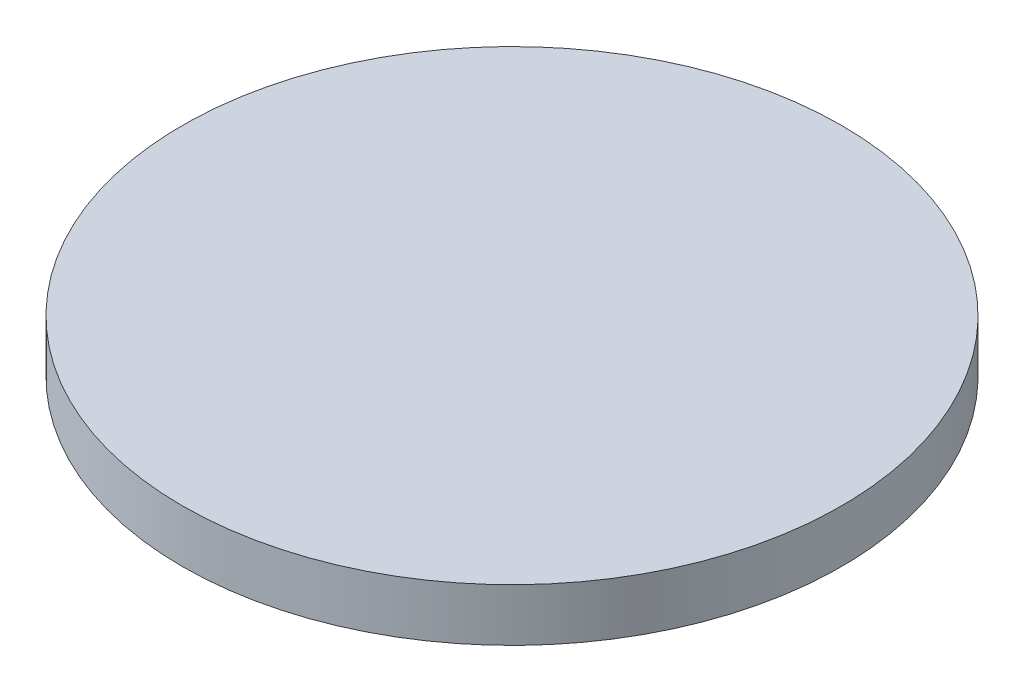
ISO-10303-21;
HEADER;
FILE_DESCRIPTION(('STEP AP214'),'2;1');
FILE_NAME('part.step','',(''),(''),'','','');
FILE_SCHEMA(('AUTOMOTIVE_DESIGN { 1 0 10303 214 1 1 1 1 }'));
ENDSEC;
DATA;
#1=APPLICATION_CONTEXT('core data for automotive mechanical design processes');
#2=APPLICATION_PROTOCOL_DEFINITION('international standard','automotive_design',2000,#1);
#3=PRODUCT_CONTEXT('',#1,'mechanical');
#4=PRODUCT('Part','Part','',(#3));
#5=PRODUCT_RELATED_PRODUCT_CATEGORY('part','',(#4));
#6=PRODUCT_DEFINITION_FORMATION('','',#4);
#7=PRODUCT_DEFINITION_CONTEXT('part definition',#1,'design');
#8=PRODUCT_DEFINITION('design','',#6,#7);
#9=PRODUCT_DEFINITION_SHAPE('','',#8);
#10=(LENGTH_UNIT() NAMED_UNIT(*) SI_UNIT(.MILLI.,.METRE.));
#11=(NAMED_UNIT(*) PLANE_ANGLE_UNIT() SI_UNIT($,.RADIAN.));
#12=(NAMED_UNIT(*) SI_UNIT($,.STERADIAN.) SOLID_ANGLE_UNIT());
#13=UNCERTAINTY_MEASURE_WITH_UNIT(LENGTH_MEASURE(1.E-05),#10,'distance_accuracy_value','');
#14=(GEOMETRIC_REPRESENTATION_CONTEXT(3) GLOBAL_UNCERTAINTY_ASSIGNED_CONTEXT((#13)) GLOBAL_UNIT_ASSIGNED_CONTEXT((#10,
#11,#12)) REPRESENTATION_CONTEXT('',''));
#15=CARTESIAN_POINT('',(0.,0.,0.));
#16=DIRECTION('',(0.,0.,1.));
#17=DIRECTION('',(1.,0.,0.));
#18=AXIS2_PLACEMENT_3D('',#15,#16,#17);
#19=CARTESIAN_POINT('',(0.,1.52,0.));
#20=DIRECTION('',(0.,-1.,0.));
#21=DIRECTION('',(0.,0.,-1.));
#22=AXIS2_PLACEMENT_3D('',#19,#20,#21);
#23=CYLINDRICAL_SURFACE('',#22,9.525);
#24=CARTESIAN_POINT('',(0.,1.52,0.));
#25=DIRECTION('',(0.,1.,0.));
#26=DIRECTION('',(0.,0.,1.));
#27=AXIS2_PLACEMENT_3D('',#24,#25,#26);
#28=CIRCLE('',#27,9.525);
#29=CARTESIAN_POINT('',(0.,1.52,9.525));
#30=VERTEX_POINT('',#29);
#31=EDGE_CURVE('E10',#30,#30,#28,.T.);
#32=ORIENTED_EDGE('',*,*,#31,.F.);
#33=EDGE_LOOP('',(#32));
#34=FACE_BOUND('',#33,.T.);
#35=CARTESIAN_POINT('',(0.,0.,0.));
#36=DIRECTION('',(0.,1.,0.));
#37=DIRECTION('',(0.,0.,1.));
#38=AXIS2_PLACEMENT_3D('',#35,#36,#37);
#39=CIRCLE('',#38,9.525);
#40=CARTESIAN_POINT('',(0.,0.,9.525));
#41=VERTEX_POINT('',#40);
#42=EDGE_CURVE('E44',#41,#41,#39,.T.);
#43=ORIENTED_EDGE('',*,*,#42,.T.);
#44=EDGE_LOOP('',(#43));
#45=FACE_BOUND('',#44,.T.);
#46=ADVANCED_FACE('F41',(#34,#45),#23,.T.);
#47=CARTESIAN_POINT('',(0.,1.52,0.));
#48=DIRECTION('',(0.,1.,0.));
#49=DIRECTION('',(0.,0.,1.));
#50=AXIS2_PLACEMENT_3D('',#47,#48,#49);
#51=PLANE('',#50);
#52=ORIENTED_EDGE('',*,*,#31,.T.);
#53=EDGE_LOOP('',(#52));
#54=FACE_BOUND('',#53,.T.);
#55=ADVANCED_FACE('F58',(#54),#51,.T.);
#56=CARTESIAN_POINT('',(0.,0.,0.));
#57=DIRECTION('',(0.,1.,0.));
#58=DIRECTION('',(0.,0.,1.));
#59=AXIS2_PLACEMENT_3D('',#56,#57,#58);
#60=PLANE('',#59);
#61=ORIENTED_EDGE('',*,*,#42,.F.);
#62=EDGE_LOOP('',(#61));
#63=FACE_BOUND('',#62,.T.);
#64=ADVANCED_FACE('F56',(#63),#60,.F.);
#65=CLOSED_SHELL('',(#46,#55,#64));
#66=MANIFOLD_SOLID_BREP('B2',#65);
#67=ADVANCED_BREP_SHAPE_REPRESENTATION('',(#18,#66),#14);
#68=SHAPE_DEFINITION_REPRESENTATION(#9,#67);
ENDSEC;
END-ISO-10303-21;
